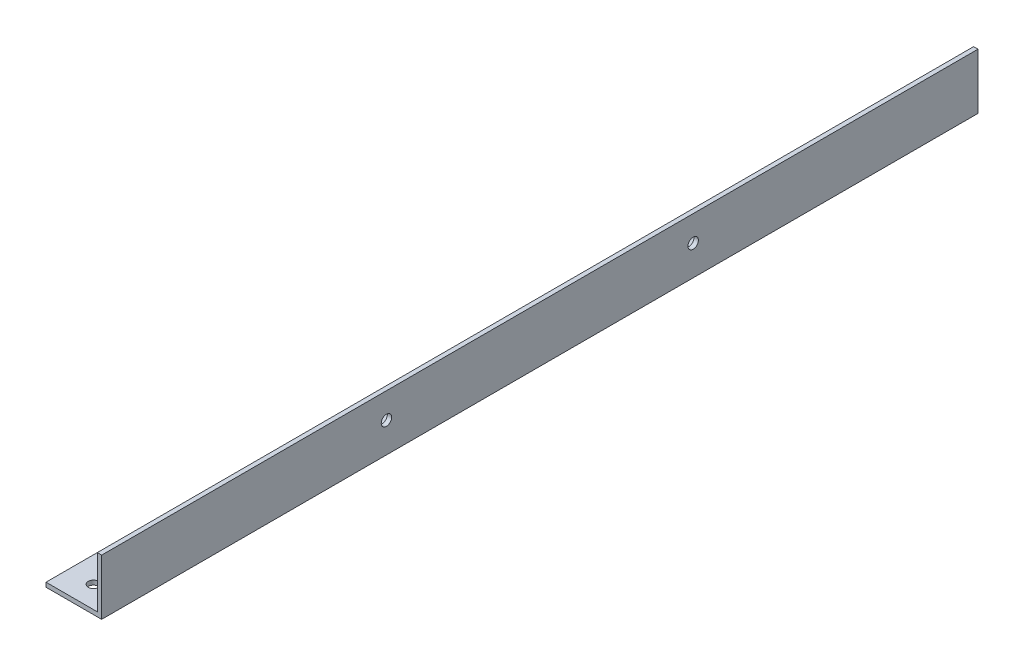
ISO-10303-21;
HEADER;
FILE_DESCRIPTION(('STEP AP214'),'2;1');
FILE_NAME('part.step','',(''),(''),'','','');
FILE_SCHEMA(('AUTOMOTIVE_DESIGN { 1 0 10303 214 1 1 1 1 }'));
ENDSEC;
DATA;
#1=APPLICATION_CONTEXT('core data for automotive mechanical design processes');
#2=APPLICATION_PROTOCOL_DEFINITION('international standard','automotive_design',2000,#1);
#3=PRODUCT_CONTEXT('',#1,'mechanical');
#4=PRODUCT('Part','Part','',(#3));
#5=PRODUCT_RELATED_PRODUCT_CATEGORY('part','',(#4));
#6=PRODUCT_DEFINITION_FORMATION('','',#4);
#7=PRODUCT_DEFINITION_CONTEXT('part definition',#1,'design');
#8=PRODUCT_DEFINITION('design','',#6,#7);
#9=PRODUCT_DEFINITION_SHAPE('','',#8);
#10=(LENGTH_UNIT() NAMED_UNIT(*) SI_UNIT(.MILLI.,.METRE.));
#11=(NAMED_UNIT(*) PLANE_ANGLE_UNIT() SI_UNIT($,.RADIAN.));
#12=(NAMED_UNIT(*) SI_UNIT($,.STERADIAN.) SOLID_ANGLE_UNIT());
#13=UNCERTAINTY_MEASURE_WITH_UNIT(LENGTH_MEASURE(1.E-05),#10,'distance_accuracy_value','');
#14=(GEOMETRIC_REPRESENTATION_CONTEXT(3) GLOBAL_UNCERTAINTY_ASSIGNED_CONTEXT((#13)) GLOBAL_UNIT_ASSIGNED_CONTEXT((#10,
#11,#12)) REPRESENTATION_CONTEXT('',''));
#15=CARTESIAN_POINT('',(0.,0.,0.));
#16=DIRECTION('',(0.,0.,1.));
#17=DIRECTION('',(1.,0.,0.));
#18=AXIS2_PLACEMENT_3D('',#15,#16,#17);
#19=CARTESIAN_POINT('',(-6.3890243902439,-4.96951219512195,200.));
#20=DIRECTION('',(1.,0.,0.));
#21=DIRECTION('',(0.,1.,0.));
#22=AXIS2_PLACEMENT_3D('',#19,#20,#21);
#23=PLANE('',#22);
#24=DIRECTION('',(0.,-1.,0.));
#25=VECTOR('',#24,1.);
#26=CARTESIAN_POINT('',(-6.3890243902439,-4.96951219512195,0.));
#27=LINE('',#26,#25);
#28=CARTESIAN_POINT('',(-6.3890243902439,-3.96951219512195,0.));
#29=VERTEX_POINT('',#28);
#30=CARTESIAN_POINT('',(-6.3890243902439,-4.96951219512195,0.));
#31=VERTEX_POINT('',#30);
#32=EDGE_CURVE('E117',#29,#31,#27,.T.);
#33=ORIENTED_EDGE('',*,*,#32,.T.);
#34=DIRECTION('',(0.,0.,-1.));
#35=VECTOR('',#34,1.);
#36=CARTESIAN_POINT('',(-6.3890243902439,-4.96951219512195,200.));
#37=LINE('',#36,#35);
#38=CARTESIAN_POINT('',(-6.3890243902439,-4.96951219512195,200.));
#39=VERTEX_POINT('',#38);
#40=EDGE_CURVE('E11',#39,#31,#37,.T.);
#41=ORIENTED_EDGE('',*,*,#40,.F.);
#42=DIRECTION('',(0.,-1.,0.));
#43=VECTOR('',#42,1.);
#44=CARTESIAN_POINT('',(-6.3890243902439,-4.96951219512195,200.));
#45=LINE('',#44,#43);
#46=CARTESIAN_POINT('',(-6.3890243902439,-3.96951219512195,200.));
#47=VERTEX_POINT('',#46);
#48=EDGE_CURVE('E128',#47,#39,#45,.T.);
#49=ORIENTED_EDGE('',*,*,#48,.F.);
#50=DIRECTION('',(0.,0.,-1.));
#51=VECTOR('',#50,1.);
#52=CARTESIAN_POINT('',(-6.3890243902439,-3.96951219512195,200.));
#53=LINE('',#52,#51);
#54=EDGE_CURVE('E113',#47,#29,#53,.T.);
#55=ORIENTED_EDGE('',*,*,#54,.T.);
#56=EDGE_LOOP('',(#33,#41,#49,#55));
#57=FACE_BOUND('',#56,.T.);
#58=ADVANCED_FACE('F33',(#57),#23,.F.);
#59=CARTESIAN_POINT('',(6.3109756097561,-4.96951219512195,200.));
#60=DIRECTION('',(0.,1.,0.));
#61=DIRECTION('',(-1.,0.,0.));
#62=AXIS2_PLACEMENT_3D('',#59,#60,#61);
#63=PLANE('',#62);
#64=CARTESIAN_POINT('',(-0.539024390243904,-4.96951219512195,4.97086035880331));
#65=DIRECTION('',(0.,1.,0.));
#66=DIRECTION('',(-1.,0.,0.));
#67=AXIS2_PLACEMENT_3D('',#64,#65,#66);
#68=CIRCLE('',#67,1.19062499999999);
#69=CARTESIAN_POINT('',(-1.72964939024389,-4.96951219512195,4.97086035880331));
#70=VERTEX_POINT('',#69);
#71=EDGE_CURVE('E269',#70,#70,#68,.T.);
#72=ORIENTED_EDGE('',*,*,#71,.T.);
#73=EDGE_LOOP('',(#72));
#74=FACE_BOUND('',#73,.T.);
#75=CARTESIAN_POINT('',(-0.539024390243904,-4.96951219512195,100.));
#76=DIRECTION('',(0.,1.,0.));
#77=DIRECTION('',(-1.,0.,0.));
#78=AXIS2_PLACEMENT_3D('',#75,#76,#77);
#79=CIRCLE('',#78,1.19062499999999);
#80=CARTESIAN_POINT('',(-1.72964939024389,-4.96951219512195,100.));
#81=VERTEX_POINT('',#80);
#82=EDGE_CURVE('E274',#81,#81,#79,.T.);
#83=ORIENTED_EDGE('',*,*,#82,.T.);
#84=EDGE_LOOP('',(#83));
#85=FACE_BOUND('',#84,.T.);
#86=CARTESIAN_POINT('',(-0.539024390243904,-4.96951219512195,195.));
#87=DIRECTION('',(0.,1.,0.));
#88=DIRECTION('',(-1.,0.,0.));
#89=AXIS2_PLACEMENT_3D('',#86,#87,#88);
#90=CIRCLE('',#89,1.19062499999999);
#91=CARTESIAN_POINT('',(-1.72964939024389,-4.96951219512195,195.));
#92=VERTEX_POINT('',#91);
#93=EDGE_CURVE('E121',#92,#92,#90,.T.);
#94=ORIENTED_EDGE('',*,*,#93,.T.);
#95=EDGE_LOOP('',(#94));
#96=FACE_BOUND('',#95,.T.);
#97=DIRECTION('',(1.,0.,0.));
#98=VECTOR('',#97,1.);
#99=CARTESIAN_POINT('',(6.3109756097561,-4.96951219512195,0.));
#100=LINE('',#99,#98);
#101=CARTESIAN_POINT('',(6.3109756097561,-4.96951219512195,0.));
#102=VERTEX_POINT('',#101);
#103=EDGE_CURVE('E120',#31,#102,#100,.T.);
#104=ORIENTED_EDGE('',*,*,#103,.T.);
#105=DIRECTION('',(0.,0.,-1.));
#106=VECTOR('',#105,1.);
#107=CARTESIAN_POINT('',(6.3109756097561,-4.96951219512195,200.));
#108=LINE('',#107,#106);
#109=CARTESIAN_POINT('',(6.3109756097561,-4.96951219512195,200.));
#110=VERTEX_POINT('',#109);
#111=EDGE_CURVE('E41',#110,#102,#108,.T.);
#112=ORIENTED_EDGE('',*,*,#111,.F.);
#113=DIRECTION('',(1.,0.,0.));
#114=VECTOR('',#113,1.);
#115=CARTESIAN_POINT('',(6.3109756097561,-4.96951219512195,200.));
#116=LINE('',#115,#114);
#117=EDGE_CURVE('E86',#39,#110,#116,.T.);
#118=ORIENTED_EDGE('',*,*,#117,.F.);
#119=ORIENTED_EDGE('',*,*,#40,.T.);
#120=EDGE_LOOP('',(#104,#112,#118,#119));
#121=FACE_BOUND('',#120,.T.);
#122=ADVANCED_FACE('F158',(#74,#85,#96,#121),#63,.F.);
#123=CARTESIAN_POINT('',(6.31097560975609,7.73048780487805,200.));
#124=DIRECTION('',(-1.,0.,0.));
#125=DIRECTION('',(0.,-1.,0.));
#126=AXIS2_PLACEMENT_3D('',#123,#124,#125);
#127=PLANE('',#126);
#128=CARTESIAN_POINT('',(6.3109756097561,1.88048780487805,65.));
#129=DIRECTION('',(-1.,0.,0.));
#130=DIRECTION('',(0.,-1.,0.));
#131=AXIS2_PLACEMENT_3D('',#128,#129,#130);
#132=CIRCLE('',#131,1.19062499999999);
#133=CARTESIAN_POINT('',(6.3109756097561,0.689862804878066,65.));
#134=VERTEX_POINT('',#133);
#135=EDGE_CURVE('E256',#134,#134,#132,.T.);
#136=ORIENTED_EDGE('',*,*,#135,.T.);
#137=EDGE_LOOP('',(#136));
#138=FACE_BOUND('',#137,.T.);
#139=CARTESIAN_POINT('',(6.3109756097561,1.88048780487805,135.));
#140=DIRECTION('',(-1.,0.,0.));
#141=DIRECTION('',(0.,-1.,0.));
#142=AXIS2_PLACEMENT_3D('',#139,#140,#141);
#143=CIRCLE('',#142,1.19062499999999);
#144=CARTESIAN_POINT('',(6.3109756097561,0.689862804878066,135.));
#145=VERTEX_POINT('',#144);
#146=EDGE_CURVE('E260',#145,#145,#143,.T.);
#147=ORIENTED_EDGE('',*,*,#146,.T.);
#148=EDGE_LOOP('',(#147));
#149=FACE_BOUND('',#148,.T.);
#150=DIRECTION('',(0.,1.,0.));
#151=VECTOR('',#150,1.);
#152=CARTESIAN_POINT('',(6.31097560975609,7.73048780487805,0.));
#153=LINE('',#152,#151);
#154=CARTESIAN_POINT('',(6.31097560975609,7.73048780487805,0.));
#155=VERTEX_POINT('',#154);
#156=EDGE_CURVE('E123',#102,#155,#153,.T.);
#157=ORIENTED_EDGE('',*,*,#156,.T.);
#158=DIRECTION('',(0.,0.,-1.));
#159=VECTOR('',#158,1.);
#160=CARTESIAN_POINT('',(6.31097560975609,7.73048780487805,200.));
#161=LINE('',#160,#159);
#162=CARTESIAN_POINT('',(6.31097560975609,7.73048780487805,200.));
#163=VERTEX_POINT('',#162);
#164=EDGE_CURVE('E108',#163,#155,#161,.T.);
#165=ORIENTED_EDGE('',*,*,#164,.F.);
#166=DIRECTION('',(0.,1.,0.));
#167=VECTOR('',#166,1.);
#168=CARTESIAN_POINT('',(6.31097560975609,7.73048780487805,200.));
#169=LINE('',#168,#167);
#170=EDGE_CURVE('E99',#110,#163,#169,.T.);
#171=ORIENTED_EDGE('',*,*,#170,.F.);
#172=ORIENTED_EDGE('',*,*,#111,.T.);
#173=EDGE_LOOP('',(#157,#165,#171,#172));
#174=FACE_BOUND('',#173,.T.);
#175=ADVANCED_FACE('F134',(#138,#149,#174),#127,.F.);
#176=CARTESIAN_POINT('',(5.31097560975609,7.73048780487805,200.));
#177=DIRECTION('',(0.,-1.,0.));
#178=DIRECTION('',(0.,0.,-1.));
#179=AXIS2_PLACEMENT_3D('',#176,#177,#178);
#180=PLANE('',#179);
#181=DIRECTION('',(-1.,0.,0.));
#182=VECTOR('',#181,1.);
#183=CARTESIAN_POINT('',(5.31097560975609,7.73048780487805,0.));
#184=LINE('',#183,#182);
#185=CARTESIAN_POINT('',(5.31097560975609,7.73048780487805,0.));
#186=VERTEX_POINT('',#185);
#187=EDGE_CURVE('E107',#155,#186,#184,.T.);
#188=ORIENTED_EDGE('',*,*,#187,.T.);
#189=DIRECTION('',(0.,0.,-1.));
#190=VECTOR('',#189,1.);
#191=CARTESIAN_POINT('',(5.31097560975609,7.73048780487805,200.));
#192=LINE('',#191,#190);
#193=CARTESIAN_POINT('',(5.31097560975609,7.73048780487805,200.));
#194=VERTEX_POINT('',#193);
#195=EDGE_CURVE('E104',#194,#186,#192,.T.);
#196=ORIENTED_EDGE('',*,*,#195,.F.);
#197=DIRECTION('',(-1.,0.,0.));
#198=VECTOR('',#197,1.);
#199=CARTESIAN_POINT('',(5.31097560975609,7.73048780487805,200.));
#200=LINE('',#199,#198);
#201=EDGE_CURVE('E93',#163,#194,#200,.T.);
#202=ORIENTED_EDGE('',*,*,#201,.F.);
#203=ORIENTED_EDGE('',*,*,#164,.T.);
#204=EDGE_LOOP('',(#188,#196,#202,#203));
#205=FACE_BOUND('',#204,.T.);
#206=ADVANCED_FACE('F105',(#205),#180,.F.);
#207=CARTESIAN_POINT('',(5.3109756097561,-3.96951219512195,200.));
#208=DIRECTION('',(1.,0.,0.));
#209=DIRECTION('',(0.,1.,0.));
#210=AXIS2_PLACEMENT_3D('',#207,#208,#209);
#211=PLANE('',#210);
#212=CARTESIAN_POINT('',(5.31097560975609,1.88048780487805,65.));
#213=DIRECTION('',(-1.,0.,0.));
#214=DIRECTION('',(0.,0.,1.));
#215=AXIS2_PLACEMENT_3D('',#212,#213,#214);
#216=CIRCLE('',#215,1.19062499999999);
#217=CARTESIAN_POINT('',(5.31097560975609,1.88048780487805,66.190625));
#218=VERTEX_POINT('',#217);
#219=EDGE_CURVE('E253',#218,#218,#216,.T.);
#220=ORIENTED_EDGE('',*,*,#219,.F.);
#221=EDGE_LOOP('',(#220));
#222=FACE_BOUND('',#221,.T.);
#223=CARTESIAN_POINT('',(5.31097560975609,1.88048780487805,135.));
#224=DIRECTION('',(-1.,0.,0.));
#225=DIRECTION('',(0.,0.,1.));
#226=AXIS2_PLACEMENT_3D('',#223,#224,#225);
#227=CIRCLE('',#226,1.19062499999999);
#228=CARTESIAN_POINT('',(5.31097560975609,1.88048780487805,136.190625));
#229=VERTEX_POINT('',#228);
#230=EDGE_CURVE('E257',#229,#229,#227,.T.);
#231=ORIENTED_EDGE('',*,*,#230,.F.);
#232=EDGE_LOOP('',(#231));
#233=FACE_BOUND('',#232,.T.);
#234=DIRECTION('',(0.,-1.,0.));
#235=VECTOR('',#234,1.);
#236=CARTESIAN_POINT('',(5.3109756097561,-3.96951219512195,0.));
#237=LINE('',#236,#235);
#238=CARTESIAN_POINT('',(5.3109756097561,-3.96951219512195,0.));
#239=VERTEX_POINT('',#238);
#240=EDGE_CURVE('E72',#186,#239,#237,.T.);
#241=ORIENTED_EDGE('',*,*,#240,.T.);
#242=DIRECTION('',(0.,0.,-1.));
#243=VECTOR('',#242,1.);
#244=CARTESIAN_POINT('',(5.3109756097561,-3.96951219512195,200.));
#245=LINE('',#244,#243);
#246=CARTESIAN_POINT('',(5.3109756097561,-3.96951219512195,200.));
#247=VERTEX_POINT('',#246);
#248=EDGE_CURVE('E109',#247,#239,#245,.T.);
#249=ORIENTED_EDGE('',*,*,#248,.F.);
#250=DIRECTION('',(0.,-1.,0.));
#251=VECTOR('',#250,1.);
#252=CARTESIAN_POINT('',(5.3109756097561,-3.96951219512195,200.));
#253=LINE('',#252,#251);
#254=EDGE_CURVE('E97',#194,#247,#253,.T.);
#255=ORIENTED_EDGE('',*,*,#254,.F.);
#256=ORIENTED_EDGE('',*,*,#195,.T.);
#257=EDGE_LOOP('',(#241,#249,#255,#256));
#258=FACE_BOUND('',#257,.T.);
#259=ADVANCED_FACE('F111',(#222,#233,#258),#211,.F.);
#260=CARTESIAN_POINT('',(-6.3890243902439,-3.96951219512195,200.));
#261=DIRECTION('',(0.,-1.,0.));
#262=DIRECTION('',(1.,0.,0.));
#263=AXIS2_PLACEMENT_3D('',#260,#261,#262);
#264=PLANE('',#263);
#265=CARTESIAN_POINT('',(-0.539024390243904,-3.96951219512195,4.97086035880331));
#266=DIRECTION('',(0.,1.,0.));
#267=DIRECTION('',(0.,0.,1.));
#268=AXIS2_PLACEMENT_3D('',#265,#266,#267);
#269=CIRCLE('',#268,1.19062499999999);
#270=CARTESIAN_POINT('',(-0.539024390243904,-3.96951219512195,6.1614853588033));
#271=VERTEX_POINT('',#270);
#272=EDGE_CURVE('E266',#271,#271,#269,.T.);
#273=ORIENTED_EDGE('',*,*,#272,.F.);
#274=EDGE_LOOP('',(#273));
#275=FACE_BOUND('',#274,.T.);
#276=CARTESIAN_POINT('',(-0.539024390243904,-3.96951219512195,100.));
#277=DIRECTION('',(0.,1.,0.));
#278=DIRECTION('',(0.,0.,1.));
#279=AXIS2_PLACEMENT_3D('',#276,#277,#278);
#280=CIRCLE('',#279,1.19062499999999);
#281=CARTESIAN_POINT('',(-0.539024390243904,-3.96951219512195,101.190625));
#282=VERTEX_POINT('',#281);
#283=EDGE_CURVE('E271',#282,#282,#280,.T.);
#284=ORIENTED_EDGE('',*,*,#283,.F.);
#285=EDGE_LOOP('',(#284));
#286=FACE_BOUND('',#285,.T.);
#287=CARTESIAN_POINT('',(-0.539024390243904,-3.96951219512195,195.));
#288=DIRECTION('',(0.,1.,0.));
#289=DIRECTION('',(0.,0.,1.));
#290=AXIS2_PLACEMENT_3D('',#287,#288,#289);
#291=CIRCLE('',#290,1.19062499999999);
#292=CARTESIAN_POINT('',(-0.539024390243904,-3.96951219512195,196.190625));
#293=VERTEX_POINT('',#292);
#294=EDGE_CURVE('E277',#293,#293,#291,.T.);
#295=ORIENTED_EDGE('',*,*,#294,.F.);
#296=EDGE_LOOP('',(#295));
#297=FACE_BOUND('',#296,.T.);
#298=DIRECTION('',(-1.,0.,0.));
#299=VECTOR('',#298,1.);
#300=CARTESIAN_POINT('',(-6.3890243902439,-3.96951219512195,0.));
#301=LINE('',#300,#299);
#302=EDGE_CURVE('E78',#239,#29,#301,.T.);
#303=ORIENTED_EDGE('',*,*,#302,.T.);
#304=ORIENTED_EDGE('',*,*,#54,.F.);
#305=DIRECTION('',(-1.,0.,0.));
#306=VECTOR('',#305,1.);
#307=CARTESIAN_POINT('',(-6.3890243902439,-3.96951219512195,200.));
#308=LINE('',#307,#306);
#309=EDGE_CURVE('E49',#247,#47,#308,.T.);
#310=ORIENTED_EDGE('',*,*,#309,.F.);
#311=ORIENTED_EDGE('',*,*,#248,.T.);
#312=EDGE_LOOP('',(#303,#304,#310,#311));
#313=FACE_BOUND('',#312,.T.);
#314=ADVANCED_FACE('F141',(#275,#286,#297,#313),#264,.F.);
#315=CARTESIAN_POINT('',(0.,0.,200.));
#316=DIRECTION('',(0.,0.,-1.));
#317=DIRECTION('',(-1.,0.,0.));
#318=AXIS2_PLACEMENT_3D('',#315,#316,#317);
#319=PLANE('',#318);
#320=ORIENTED_EDGE('',*,*,#48,.T.);
#321=ORIENTED_EDGE('',*,*,#117,.T.);
#322=ORIENTED_EDGE('',*,*,#170,.T.);
#323=ORIENTED_EDGE('',*,*,#201,.T.);
#324=ORIENTED_EDGE('',*,*,#254,.T.);
#325=ORIENTED_EDGE('',*,*,#309,.T.);
#326=EDGE_LOOP('',(#320,#321,#322,#323,#324,#325));
#327=FACE_BOUND('',#326,.T.);
#328=ADVANCED_FACE('F95',(#327),#319,.F.);
#329=CARTESIAN_POINT('',(0.,0.,0.));
#330=DIRECTION('',(0.,0.,-1.));
#331=DIRECTION('',(-1.,0.,0.));
#332=AXIS2_PLACEMENT_3D('',#329,#330,#331);
#333=PLANE('',#332);
#334=ORIENTED_EDGE('',*,*,#32,.F.);
#335=ORIENTED_EDGE('',*,*,#302,.F.);
#336=ORIENTED_EDGE('',*,*,#240,.F.);
#337=ORIENTED_EDGE('',*,*,#187,.F.);
#338=ORIENTED_EDGE('',*,*,#156,.F.);
#339=ORIENTED_EDGE('',*,*,#103,.F.);
#340=EDGE_LOOP('',(#334,#335,#336,#337,#338,#339));
#341=FACE_BOUND('',#340,.T.);
#342=ADVANCED_FACE('F137',(#341),#333,.T.);
#343=CARTESIAN_POINT('',(-0.539024390243904,-3.96951219512195,195.));
#344=DIRECTION('',(0.,1.,0.));
#345=DIRECTION('',(0.,0.,1.));
#346=AXIS2_PLACEMENT_3D('',#343,#344,#345);
#347=CYLINDRICAL_SURFACE('',#346,1.19062499999999);
#348=ORIENTED_EDGE('',*,*,#294,.T.);
#349=EDGE_LOOP('',(#348));
#350=FACE_BOUND('',#349,.T.);
#351=ORIENTED_EDGE('',*,*,#93,.F.);
#352=EDGE_LOOP('',(#351));
#353=FACE_BOUND('',#352,.T.);
#354=ADVANCED_FACE('F197',(#350,#353),#347,.F.);
#355=CARTESIAN_POINT('',(-0.539024390243904,-3.96951219512195,100.));
#356=DIRECTION('',(0.,1.,0.));
#357=DIRECTION('',(0.,0.,1.));
#358=AXIS2_PLACEMENT_3D('',#355,#356,#357);
#359=CYLINDRICAL_SURFACE('',#358,1.19062499999999);
#360=ORIENTED_EDGE('',*,*,#283,.T.);
#361=EDGE_LOOP('',(#360));
#362=FACE_BOUND('',#361,.T.);
#363=ORIENTED_EDGE('',*,*,#82,.F.);
#364=EDGE_LOOP('',(#363));
#365=FACE_BOUND('',#364,.T.);
#366=ADVANCED_FACE('F202',(#362,#365),#359,.F.);
#367=CARTESIAN_POINT('',(-0.539024390243904,-3.96951219512195,4.97086035880331));
#368=DIRECTION('',(0.,1.,0.));
#369=DIRECTION('',(0.,0.,1.));
#370=AXIS2_PLACEMENT_3D('',#367,#368,#369);
#371=CYLINDRICAL_SURFACE('',#370,1.19062499999999);
#372=ORIENTED_EDGE('',*,*,#272,.T.);
#373=EDGE_LOOP('',(#372));
#374=FACE_BOUND('',#373,.T.);
#375=ORIENTED_EDGE('',*,*,#71,.F.);
#376=EDGE_LOOP('',(#375));
#377=FACE_BOUND('',#376,.T.);
#378=ADVANCED_FACE('F210',(#374,#377),#371,.F.);
#379=CARTESIAN_POINT('',(5.3109756097561,1.88048780487805,135.));
#380=DIRECTION('',(-1.,0.,0.));
#381=DIRECTION('',(0.,0.,1.));
#382=AXIS2_PLACEMENT_3D('',#379,#380,#381);
#383=CYLINDRICAL_SURFACE('',#382,1.19062499999999);
#384=ORIENTED_EDGE('',*,*,#230,.T.);
#385=EDGE_LOOP('',(#384));
#386=FACE_BOUND('',#385,.T.);
#387=ORIENTED_EDGE('',*,*,#146,.F.);
#388=EDGE_LOOP('',(#387));
#389=FACE_BOUND('',#388,.T.);
#390=ADVANCED_FACE('F218',(#386,#389),#383,.F.);
#391=CARTESIAN_POINT('',(5.3109756097561,1.88048780487805,65.));
#392=DIRECTION('',(-1.,0.,0.));
#393=DIRECTION('',(0.,0.,1.));
#394=AXIS2_PLACEMENT_3D('',#391,#392,#393);
#395=CYLINDRICAL_SURFACE('',#394,1.19062499999999);
#396=ORIENTED_EDGE('',*,*,#219,.T.);
#397=EDGE_LOOP('',(#396));
#398=FACE_BOUND('',#397,.T.);
#399=ORIENTED_EDGE('',*,*,#135,.F.);
#400=EDGE_LOOP('',(#399));
#401=FACE_BOUND('',#400,.T.);
#402=ADVANCED_FACE('F225',(#398,#401),#395,.F.);
#403=CLOSED_SHELL('',(#58,#122,#175,#206,#259,#314,#328,#342,#354,#366,#378,#390,#402));
#404=MANIFOLD_SOLID_BREP('B2',#403);
#405=ADVANCED_BREP_SHAPE_REPRESENTATION('',(#18,#404),#14);
#406=SHAPE_DEFINITION_REPRESENTATION(#9,#405);
ENDSEC;
END-ISO-10303-21;
